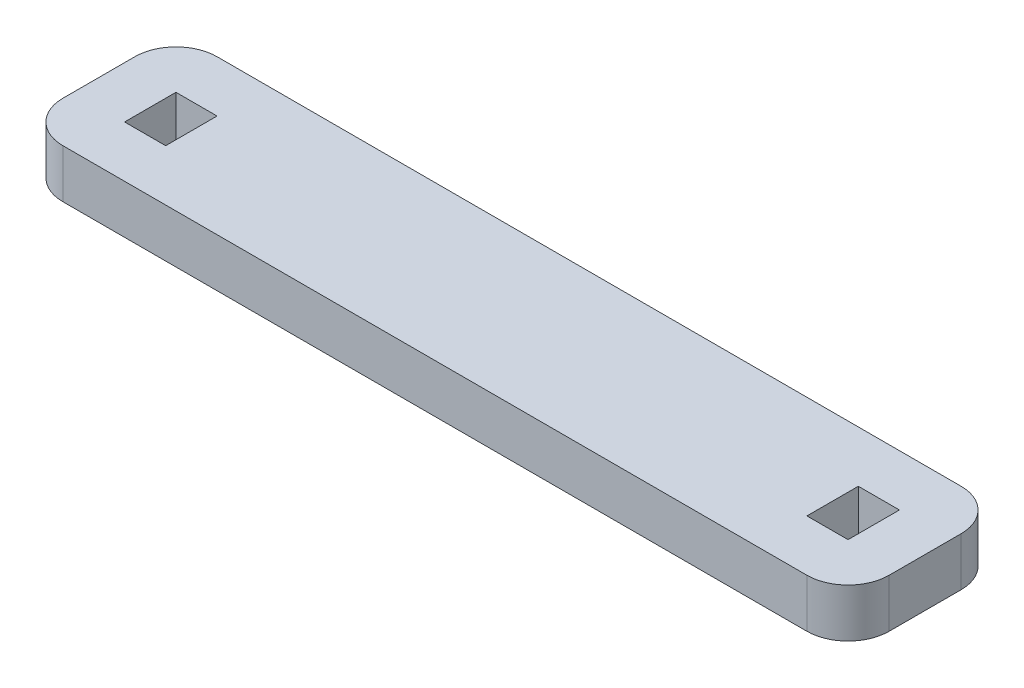
ISO-10303-21;
HEADER;
FILE_DESCRIPTION(('STEP AP214'),'2;1');
FILE_NAME('part.step','',(''),(''),'','','');
FILE_SCHEMA(('AUTOMOTIVE_DESIGN { 1 0 10303 214 1 1 1 1 }'));
ENDSEC;
DATA;
#1=APPLICATION_CONTEXT('core data for automotive mechanical design processes');
#2=APPLICATION_PROTOCOL_DEFINITION('international standard','automotive_design',2000,#1);
#3=PRODUCT_CONTEXT('',#1,'mechanical');
#4=PRODUCT('Part','Part','',(#3));
#5=PRODUCT_RELATED_PRODUCT_CATEGORY('part','',(#4));
#6=PRODUCT_DEFINITION_FORMATION('','',#4);
#7=PRODUCT_DEFINITION_CONTEXT('part definition',#1,'design');
#8=PRODUCT_DEFINITION('design','',#6,#7);
#9=PRODUCT_DEFINITION_SHAPE('','',#8);
#10=(LENGTH_UNIT() NAMED_UNIT(*) SI_UNIT(.MILLI.,.METRE.));
#11=(NAMED_UNIT(*) PLANE_ANGLE_UNIT() SI_UNIT($,.RADIAN.));
#12=(NAMED_UNIT(*) SI_UNIT($,.STERADIAN.) SOLID_ANGLE_UNIT());
#13=UNCERTAINTY_MEASURE_WITH_UNIT(LENGTH_MEASURE(1.E-05),#10,'distance_accuracy_value','');
#14=(GEOMETRIC_REPRESENTATION_CONTEXT(3) GLOBAL_UNCERTAINTY_ASSIGNED_CONTEXT((#13)) GLOBAL_UNIT_ASSIGNED_CONTEXT((#10,
#11,#12)) REPRESENTATION_CONTEXT('',''));
#15=CARTESIAN_POINT('',(0.,0.,0.));
#16=DIRECTION('',(0.,0.,1.));
#17=DIRECTION('',(1.,0.,0.));
#18=AXIS2_PLACEMENT_3D('',#15,#16,#17);
#19=CARTESIAN_POINT('',(0.,1.5,0.));
#20=DIRECTION('',(0.,1.,0.));
#21=DIRECTION('',(0.,0.,1.));
#22=AXIS2_PLACEMENT_3D('',#19,#20,#21);
#23=PLANE('',#22);
#24=DIRECTION('',(-1.,0.,0.));
#25=VECTOR('',#24,1.);
#26=CARTESIAN_POINT('',(25.527,1.5,-4.7625));
#27=LINE('',#26,#25);
#28=CARTESIAN_POINT('',(22.987,1.5,-4.7625));
#29=VERTEX_POINT('',#28);
#30=CARTESIAN_POINT('',(-22.987,1.5,-4.7625));
#31=VERTEX_POINT('',#30);
#32=EDGE_CURVE('E274',#29,#31,#27,.T.);
#33=ORIENTED_EDGE('',*,*,#32,.T.);
#34=CARTESIAN_POINT('',(-22.987,1.5,-2.2225));
#35=DIRECTION('',(0.,1.,0.));
#36=DIRECTION('',(0.,0.,1.));
#37=AXIS2_PLACEMENT_3D('',#34,#35,#36);
#38=CIRCLE('',#37,2.54);
#39=CARTESIAN_POINT('',(-25.527,1.5,-2.2225));
#40=VERTEX_POINT('',#39);
#41=EDGE_CURVE('E310',#31,#40,#38,.T.);
#42=ORIENTED_EDGE('',*,*,#41,.T.);
#43=DIRECTION('',(0.,0.,1.));
#44=VECTOR('',#43,1.);
#45=CARTESIAN_POINT('',(-25.527,1.5,4.7625));
#46=LINE('',#45,#44);
#47=CARTESIAN_POINT('',(-25.527,1.5,2.2225));
#48=VERTEX_POINT('',#47);
#49=EDGE_CURVE('E244',#40,#48,#46,.T.);
#50=ORIENTED_EDGE('',*,*,#49,.T.);
#51=CARTESIAN_POINT('',(-22.987,1.5,2.2225));
#52=DIRECTION('',(0.,1.,0.));
#53=DIRECTION('',(0.,0.,1.));
#54=AXIS2_PLACEMENT_3D('',#51,#52,#53);
#55=CIRCLE('',#54,2.54);
#56=CARTESIAN_POINT('',(-22.987,1.5,4.7625));
#57=VERTEX_POINT('',#56);
#58=EDGE_CURVE('E260',#48,#57,#55,.T.);
#59=ORIENTED_EDGE('',*,*,#58,.T.);
#60=DIRECTION('',(1.,0.,0.));
#61=VECTOR('',#60,1.);
#62=CARTESIAN_POINT('',(25.527,1.5,4.7625));
#63=LINE('',#62,#61);
#64=CARTESIAN_POINT('',(22.987,1.5,4.7625));
#65=VERTEX_POINT('',#64);
#66=EDGE_CURVE('E248',#57,#65,#63,.T.);
#67=ORIENTED_EDGE('',*,*,#66,.T.);
#68=CARTESIAN_POINT('',(22.987,1.5,2.2225));
#69=DIRECTION('',(0.,1.,0.));
#70=DIRECTION('',(0.,0.,1.));
#71=AXIS2_PLACEMENT_3D('',#68,#69,#70);
#72=CIRCLE('',#71,2.54);
#73=CARTESIAN_POINT('',(25.527,1.5,2.2225));
#74=VERTEX_POINT('',#73);
#75=EDGE_CURVE('E66',#65,#74,#72,.T.);
#76=ORIENTED_EDGE('',*,*,#75,.T.);
#77=DIRECTION('',(0.,0.,-1.));
#78=VECTOR('',#77,1.);
#79=CARTESIAN_POINT('',(25.527,1.5,4.7625));
#80=LINE('',#79,#78);
#81=CARTESIAN_POINT('',(25.527,1.5,-2.2225));
#82=VERTEX_POINT('',#81);
#83=EDGE_CURVE('E271',#74,#82,#80,.T.);
#84=ORIENTED_EDGE('',*,*,#83,.T.);
#85=CARTESIAN_POINT('',(22.987,1.5,-2.2225));
#86=DIRECTION('',(0.,1.,0.));
#87=DIRECTION('',(0.,0.,1.));
#88=AXIS2_PLACEMENT_3D('',#85,#86,#87);
#89=CIRCLE('',#88,2.54);
#90=EDGE_CURVE('E268',#82,#29,#89,.T.);
#91=ORIENTED_EDGE('',*,*,#90,.T.);
#92=EDGE_LOOP('',(#33,#42,#50,#59,#67,#76,#84,#91));
#93=FACE_BOUND('',#92,.T.);
#94=DIRECTION('',(1.,0.,0.));
#95=VECTOR('',#94,1.);
#96=CARTESIAN_POINT('',(-19.812,1.5,1.5875));
#97=LINE('',#96,#95);
#98=CARTESIAN_POINT('',(-22.352,1.5,1.5875));
#99=VERTEX_POINT('',#98);
#100=CARTESIAN_POINT('',(-19.812,1.5,1.5875));
#101=VERTEX_POINT('',#100);
#102=EDGE_CURVE('E211',#99,#101,#97,.T.);
#103=ORIENTED_EDGE('',*,*,#102,.F.);
#104=DIRECTION('',(0.,0.,1.));
#105=VECTOR('',#104,1.);
#106=CARTESIAN_POINT('',(-22.352,1.5,1.5875));
#107=LINE('',#106,#105);
#108=CARTESIAN_POINT('',(-22.352,1.5,-1.5875));
#109=VERTEX_POINT('',#108);
#110=EDGE_CURVE('E208',#109,#99,#107,.T.);
#111=ORIENTED_EDGE('',*,*,#110,.F.);
#112=DIRECTION('',(-1.,0.,0.));
#113=VECTOR('',#112,1.);
#114=CARTESIAN_POINT('',(-19.812,1.5,-1.5875));
#115=LINE('',#114,#113);
#116=CARTESIAN_POINT('',(-19.812,1.5,-1.5875));
#117=VERTEX_POINT('',#116);
#118=EDGE_CURVE('E218',#117,#109,#115,.T.);
#119=ORIENTED_EDGE('',*,*,#118,.F.);
#120=DIRECTION('',(0.,0.,-1.));
#121=VECTOR('',#120,1.);
#122=CARTESIAN_POINT('',(-19.812,1.5,1.5875));
#123=LINE('',#122,#121);
#124=EDGE_CURVE('E222',#101,#117,#123,.T.);
#125=ORIENTED_EDGE('',*,*,#124,.F.);
#126=EDGE_LOOP('',(#103,#111,#119,#125));
#127=FACE_BOUND('',#126,.T.);
#128=DIRECTION('',(1.,0.,0.));
#129=VECTOR('',#128,1.);
#130=CARTESIAN_POINT('',(22.352,1.5,1.5875));
#131=LINE('',#130,#129);
#132=CARTESIAN_POINT('',(19.812,1.5,1.5875));
#133=VERTEX_POINT('',#132);
#134=CARTESIAN_POINT('',(22.352,1.5,1.5875));
#135=VERTEX_POINT('',#134);
#136=EDGE_CURVE('E169',#133,#135,#131,.T.);
#137=ORIENTED_EDGE('',*,*,#136,.F.);
#138=DIRECTION('',(0.,0.,1.));
#139=VECTOR('',#138,1.);
#140=CARTESIAN_POINT('',(19.812,1.5,1.5875));
#141=LINE('',#140,#139);
#142=CARTESIAN_POINT('',(19.812,1.5,-1.5875));
#143=VERTEX_POINT('',#142);
#144=EDGE_CURVE('E159',#143,#133,#141,.T.);
#145=ORIENTED_EDGE('',*,*,#144,.F.);
#146=DIRECTION('',(-1.,0.,0.));
#147=VECTOR('',#146,1.);
#148=CARTESIAN_POINT('',(22.352,1.5,-1.5875));
#149=LINE('',#148,#147);
#150=CARTESIAN_POINT('',(22.352,1.5,-1.5875));
#151=VERTEX_POINT('',#150);
#152=EDGE_CURVE('E184',#151,#143,#149,.T.);
#153=ORIENTED_EDGE('',*,*,#152,.F.);
#154=DIRECTION('',(0.,0.,-1.));
#155=VECTOR('',#154,1.);
#156=CARTESIAN_POINT('',(22.352,1.5,1.5875));
#157=LINE('',#156,#155);
#158=EDGE_CURVE('E182',#135,#151,#157,.T.);
#159=ORIENTED_EDGE('',*,*,#158,.F.);
#160=EDGE_LOOP('',(#137,#145,#153,#159));
#161=FACE_BOUND('',#160,.T.);
#162=ADVANCED_FACE('F44',(#93,#127,#161),#23,.T.);
#163=CARTESIAN_POINT('',(0.,-1.5,0.));
#164=DIRECTION('',(0.,1.,0.));
#165=DIRECTION('',(0.,0.,1.));
#166=AXIS2_PLACEMENT_3D('',#163,#164,#165);
#167=PLANE('',#166);
#168=DIRECTION('',(0.,0.,1.));
#169=VECTOR('',#168,1.);
#170=CARTESIAN_POINT('',(-22.352,-1.5,1.5875));
#171=LINE('',#170,#169);
#172=CARTESIAN_POINT('',(-22.352,-1.5,-1.5875));
#173=VERTEX_POINT('',#172);
#174=CARTESIAN_POINT('',(-22.352,-1.5,1.5875));
#175=VERTEX_POINT('',#174);
#176=EDGE_CURVE('E177',#173,#175,#171,.T.);
#177=ORIENTED_EDGE('',*,*,#176,.T.);
#178=DIRECTION('',(1.,0.,0.));
#179=VECTOR('',#178,1.);
#180=CARTESIAN_POINT('',(-19.812,-1.5,1.5875));
#181=LINE('',#180,#179);
#182=CARTESIAN_POINT('',(-19.812,-1.5,1.5875));
#183=VERTEX_POINT('',#182);
#184=EDGE_CURVE('E226',#175,#183,#181,.T.);
#185=ORIENTED_EDGE('',*,*,#184,.T.);
#186=DIRECTION('',(0.,0.,-1.));
#187=VECTOR('',#186,1.);
#188=CARTESIAN_POINT('',(-19.812,-1.5,1.5875));
#189=LINE('',#188,#187);
#190=CARTESIAN_POINT('',(-19.812,-1.5,-1.5875));
#191=VERTEX_POINT('',#190);
#192=EDGE_CURVE('E229',#183,#191,#189,.T.);
#193=ORIENTED_EDGE('',*,*,#192,.T.);
#194=DIRECTION('',(-1.,0.,0.));
#195=VECTOR('',#194,1.);
#196=CARTESIAN_POINT('',(-19.812,-1.5,-1.5875));
#197=LINE('',#196,#195);
#198=EDGE_CURVE('E212',#191,#173,#197,.T.);
#199=ORIENTED_EDGE('',*,*,#198,.T.);
#200=EDGE_LOOP('',(#177,#185,#193,#199));
#201=FACE_BOUND('',#200,.T.);
#202=DIRECTION('',(0.,0.,1.));
#203=VECTOR('',#202,1.);
#204=CARTESIAN_POINT('',(-25.527,-1.5,4.7625));
#205=LINE('',#204,#203);
#206=CARTESIAN_POINT('',(-25.527,-1.5,-2.2225));
#207=VERTEX_POINT('',#206);
#208=CARTESIAN_POINT('',(-25.527,-1.5,2.2225));
#209=VERTEX_POINT('',#208);
#210=EDGE_CURVE('E243',#207,#209,#205,.T.);
#211=ORIENTED_EDGE('',*,*,#210,.F.);
#212=CARTESIAN_POINT('',(-22.987,-1.5,-2.2225));
#213=DIRECTION('',(0.,1.,0.));
#214=DIRECTION('',(0.,0.,1.));
#215=AXIS2_PLACEMENT_3D('',#212,#213,#214);
#216=CIRCLE('',#215,2.54);
#217=CARTESIAN_POINT('',(-22.987,-1.5,-4.7625));
#218=VERTEX_POINT('',#217);
#219=EDGE_CURVE('E298',#207,#218,#216,.F.);
#220=ORIENTED_EDGE('',*,*,#219,.T.);
#221=DIRECTION('',(-1.,0.,0.));
#222=VECTOR('',#221,1.);
#223=CARTESIAN_POINT('',(25.527,-1.5,-4.7625));
#224=LINE('',#223,#222);
#225=CARTESIAN_POINT('',(22.987,-1.5,-4.7625));
#226=VERTEX_POINT('',#225);
#227=EDGE_CURVE('E249',#226,#218,#224,.T.);
#228=ORIENTED_EDGE('',*,*,#227,.F.);
#229=CARTESIAN_POINT('',(22.987,-1.5,-2.2225));
#230=DIRECTION('',(0.,1.,0.));
#231=DIRECTION('',(0.,0.,1.));
#232=AXIS2_PLACEMENT_3D('',#229,#230,#231);
#233=CIRCLE('',#232,2.54);
#234=CARTESIAN_POINT('',(25.527,-1.5,-2.2225));
#235=VERTEX_POINT('',#234);
#236=EDGE_CURVE('E296',#226,#235,#233,.F.);
#237=ORIENTED_EDGE('',*,*,#236,.T.);
#238=DIRECTION('',(0.,0.,-1.));
#239=VECTOR('',#238,1.);
#240=CARTESIAN_POINT('',(25.527,-1.5,4.7625));
#241=LINE('',#240,#239);
#242=CARTESIAN_POINT('',(25.527,-1.5,2.2225));
#243=VERTEX_POINT('',#242);
#244=EDGE_CURVE('E284',#243,#235,#241,.T.);
#245=ORIENTED_EDGE('',*,*,#244,.F.);
#246=CARTESIAN_POINT('',(22.987,-1.5,2.2225));
#247=DIRECTION('',(0.,1.,0.));
#248=DIRECTION('',(0.,0.,1.));
#249=AXIS2_PLACEMENT_3D('',#246,#247,#248);
#250=CIRCLE('',#249,2.54);
#251=CARTESIAN_POINT('',(22.987,-1.5,4.7625));
#252=VERTEX_POINT('',#251);
#253=EDGE_CURVE('E294',#243,#252,#250,.F.);
#254=ORIENTED_EDGE('',*,*,#253,.T.);
#255=DIRECTION('',(1.,0.,0.));
#256=VECTOR('',#255,1.);
#257=CARTESIAN_POINT('',(25.527,-1.5,4.7625));
#258=LINE('',#257,#256);
#259=CARTESIAN_POINT('',(-22.987,-1.5,4.7625));
#260=VERTEX_POINT('',#259);
#261=EDGE_CURVE('E281',#260,#252,#258,.T.);
#262=ORIENTED_EDGE('',*,*,#261,.F.);
#263=CARTESIAN_POINT('',(-22.987,-1.5,2.2225));
#264=DIRECTION('',(0.,1.,0.));
#265=DIRECTION('',(0.,0.,1.));
#266=AXIS2_PLACEMENT_3D('',#263,#264,#265);
#267=CIRCLE('',#266,2.54);
#268=EDGE_CURVE('E292',#260,#209,#267,.F.);
#269=ORIENTED_EDGE('',*,*,#268,.T.);
#270=EDGE_LOOP('',(#211,#220,#228,#237,#245,#254,#262,#269));
#271=FACE_BOUND('',#270,.T.);
#272=DIRECTION('',(0.,0.,1.));
#273=VECTOR('',#272,1.);
#274=CARTESIAN_POINT('',(19.812,-1.5,1.5875));
#275=LINE('',#274,#273);
#276=CARTESIAN_POINT('',(19.812,-1.5,-1.5875));
#277=VERTEX_POINT('',#276);
#278=CARTESIAN_POINT('',(19.812,-1.5,1.5875));
#279=VERTEX_POINT('',#278);
#280=EDGE_CURVE('E196',#277,#279,#275,.T.);
#281=ORIENTED_EDGE('',*,*,#280,.T.);
#282=DIRECTION('',(1.,0.,0.));
#283=VECTOR('',#282,1.);
#284=CARTESIAN_POINT('',(22.352,-1.5,1.5875));
#285=LINE('',#284,#283);
#286=CARTESIAN_POINT('',(22.352,-1.5,1.5875));
#287=VERTEX_POINT('',#286);
#288=EDGE_CURVE('E176',#279,#287,#285,.T.);
#289=ORIENTED_EDGE('',*,*,#288,.T.);
#290=DIRECTION('',(0.,0.,-1.));
#291=VECTOR('',#290,1.);
#292=CARTESIAN_POINT('',(22.352,-1.5,1.5875));
#293=LINE('',#292,#291);
#294=CARTESIAN_POINT('',(22.352,-1.5,-1.5875));
#295=VERTEX_POINT('',#294);
#296=EDGE_CURVE('E199',#287,#295,#293,.T.);
#297=ORIENTED_EDGE('',*,*,#296,.T.);
#298=DIRECTION('',(-1.,0.,0.));
#299=VECTOR('',#298,1.);
#300=CARTESIAN_POINT('',(22.352,-1.5,-1.5875));
#301=LINE('',#300,#299);
#302=EDGE_CURVE('E170',#295,#277,#301,.T.);
#303=ORIENTED_EDGE('',*,*,#302,.T.);
#304=EDGE_LOOP('',(#281,#289,#297,#303));
#305=FACE_BOUND('',#304,.T.);
#306=ADVANCED_FACE('F331',(#201,#271,#305),#167,.F.);
#307=CARTESIAN_POINT('',(-25.527,1.5,4.7625));
#308=DIRECTION('',(1.,0.,0.));
#309=DIRECTION('',(0.,0.,-1.));
#310=AXIS2_PLACEMENT_3D('',#307,#308,#309);
#311=PLANE('',#310);
#312=ORIENTED_EDGE('',*,*,#49,.F.);
#313=DIRECTION('',(0.,-1.,0.));
#314=VECTOR('',#313,1.);
#315=CARTESIAN_POINT('',(-25.527,1.5,-2.2225));
#316=LINE('',#315,#314);
#317=EDGE_CURVE('E289',#40,#207,#316,.T.);
#318=ORIENTED_EDGE('',*,*,#317,.T.);
#319=ORIENTED_EDGE('',*,*,#210,.T.);
#320=DIRECTION('',(0.,-1.,0.));
#321=VECTOR('',#320,1.);
#322=CARTESIAN_POINT('',(-25.527,1.5,2.2225));
#323=LINE('',#322,#321);
#324=EDGE_CURVE('E278',#209,#48,#323,.F.);
#325=ORIENTED_EDGE('',*,*,#324,.T.);
#326=EDGE_LOOP('',(#312,#318,#319,#325));
#327=FACE_BOUND('',#326,.T.);
#328=ADVANCED_FACE('F341',(#327),#311,.F.);
#329=CARTESIAN_POINT('',(25.527,1.5,4.7625));
#330=DIRECTION('',(0.,0.,-1.));
#331=DIRECTION('',(-1.,0.,0.));
#332=AXIS2_PLACEMENT_3D('',#329,#330,#331);
#333=PLANE('',#332);
#334=ORIENTED_EDGE('',*,*,#261,.T.);
#335=DIRECTION('',(0.,-1.,0.));
#336=VECTOR('',#335,1.);
#337=CARTESIAN_POINT('',(22.987,1.5,4.7625));
#338=LINE('',#337,#336);
#339=EDGE_CURVE('E12',#252,#65,#338,.F.);
#340=ORIENTED_EDGE('',*,*,#339,.T.);
#341=ORIENTED_EDGE('',*,*,#66,.F.);
#342=DIRECTION('',(0.,-1.,0.));
#343=VECTOR('',#342,1.);
#344=CARTESIAN_POINT('',(-22.987,1.5,4.7625));
#345=LINE('',#344,#343);
#346=EDGE_CURVE('E52',#57,#260,#345,.T.);
#347=ORIENTED_EDGE('',*,*,#346,.T.);
#348=EDGE_LOOP('',(#334,#340,#341,#347));
#349=FACE_BOUND('',#348,.T.);
#350=ADVANCED_FACE('F325',(#349),#333,.F.);
#351=CARTESIAN_POINT('',(25.527,1.5,4.7625));
#352=DIRECTION('',(-1.,0.,0.));
#353=DIRECTION('',(0.,0.,1.));
#354=AXIS2_PLACEMENT_3D('',#351,#352,#353);
#355=PLANE('',#354);
#356=ORIENTED_EDGE('',*,*,#244,.T.);
#357=DIRECTION('',(0.,-1.,0.));
#358=VECTOR('',#357,1.);
#359=CARTESIAN_POINT('',(25.527,1.5,-2.2225));
#360=LINE('',#359,#358);
#361=EDGE_CURVE('E59',#235,#82,#360,.F.);
#362=ORIENTED_EDGE('',*,*,#361,.T.);
#363=ORIENTED_EDGE('',*,*,#83,.F.);
#364=DIRECTION('',(0.,-1.,0.));
#365=VECTOR('',#364,1.);
#366=CARTESIAN_POINT('',(25.527,1.5,2.2225));
#367=LINE('',#366,#365);
#368=EDGE_CURVE('E315',#74,#243,#367,.T.);
#369=ORIENTED_EDGE('',*,*,#368,.T.);
#370=EDGE_LOOP('',(#356,#362,#363,#369));
#371=FACE_BOUND('',#370,.T.);
#372=ADVANCED_FACE('F337',(#371),#355,.F.);
#373=CARTESIAN_POINT('',(25.527,1.5,-4.7625));
#374=DIRECTION('',(0.,0.,1.));
#375=DIRECTION('',(1.,0.,0.));
#376=AXIS2_PLACEMENT_3D('',#373,#374,#375);
#377=PLANE('',#376);
#378=ORIENTED_EDGE('',*,*,#227,.T.);
#379=DIRECTION('',(0.,-1.,0.));
#380=VECTOR('',#379,1.);
#381=CARTESIAN_POINT('',(-22.987,1.5,-4.7625));
#382=LINE('',#381,#380);
#383=EDGE_CURVE('E264',#218,#31,#382,.F.);
#384=ORIENTED_EDGE('',*,*,#383,.T.);
#385=ORIENTED_EDGE('',*,*,#32,.F.);
#386=DIRECTION('',(0.,-1.,0.));
#387=VECTOR('',#386,1.);
#388=CARTESIAN_POINT('',(22.987,1.5,-4.7625));
#389=LINE('',#388,#387);
#390=EDGE_CURVE('E299',#29,#226,#389,.T.);
#391=ORIENTED_EDGE('',*,*,#390,.T.);
#392=EDGE_LOOP('',(#378,#384,#385,#391));
#393=FACE_BOUND('',#392,.T.);
#394=ADVANCED_FACE('F306',(#393),#377,.F.);
#395=CARTESIAN_POINT('',(-22.352,1.5,1.5875));
#396=DIRECTION('',(1.,0.,0.));
#397=DIRECTION('',(0.,0.,-1.));
#398=AXIS2_PLACEMENT_3D('',#395,#396,#397);
#399=PLANE('',#398);
#400=ORIENTED_EDGE('',*,*,#176,.F.);
#401=DIRECTION('',(0.,-1.,0.));
#402=VECTOR('',#401,1.);
#403=CARTESIAN_POINT('',(-22.352,1.5,-1.5875));
#404=LINE('',#403,#402);
#405=EDGE_CURVE('E221',#109,#173,#404,.T.);
#406=ORIENTED_EDGE('',*,*,#405,.F.);
#407=ORIENTED_EDGE('',*,*,#110,.T.);
#408=DIRECTION('',(0.,-1.,0.));
#409=VECTOR('',#408,1.);
#410=CARTESIAN_POINT('',(-22.352,1.5,1.5875));
#411=LINE('',#410,#409);
#412=EDGE_CURVE('E240',#99,#175,#411,.T.);
#413=ORIENTED_EDGE('',*,*,#412,.T.);
#414=EDGE_LOOP('',(#400,#406,#407,#413));
#415=FACE_BOUND('',#414,.T.);
#416=ADVANCED_FACE('F356',(#415),#399,.T.);
#417=CARTESIAN_POINT('',(-19.812,1.5,1.5875));
#418=DIRECTION('',(0.,0.,-1.));
#419=DIRECTION('',(-1.,0.,0.));
#420=AXIS2_PLACEMENT_3D('',#417,#418,#419);
#421=PLANE('',#420);
#422=ORIENTED_EDGE('',*,*,#184,.F.);
#423=ORIENTED_EDGE('',*,*,#412,.F.);
#424=ORIENTED_EDGE('',*,*,#102,.T.);
#425=DIRECTION('',(0.,-1.,0.));
#426=VECTOR('',#425,1.);
#427=CARTESIAN_POINT('',(-19.812,1.5,1.5875));
#428=LINE('',#427,#426);
#429=EDGE_CURVE('E238',#101,#183,#428,.T.);
#430=ORIENTED_EDGE('',*,*,#429,.T.);
#431=EDGE_LOOP('',(#422,#423,#424,#430));
#432=FACE_BOUND('',#431,.T.);
#433=ADVANCED_FACE('F438',(#432),#421,.T.);
#434=CARTESIAN_POINT('',(-19.812,1.5,1.5875));
#435=DIRECTION('',(-1.,0.,0.));
#436=DIRECTION('',(0.,0.,1.));
#437=AXIS2_PLACEMENT_3D('',#434,#435,#436);
#438=PLANE('',#437);
#439=ORIENTED_EDGE('',*,*,#192,.F.);
#440=ORIENTED_EDGE('',*,*,#429,.F.);
#441=ORIENTED_EDGE('',*,*,#124,.T.);
#442=DIRECTION('',(0.,-1.,0.));
#443=VECTOR('',#442,1.);
#444=CARTESIAN_POINT('',(-19.812,1.5,-1.5875));
#445=LINE('',#444,#443);
#446=EDGE_CURVE('E236',#117,#191,#445,.T.);
#447=ORIENTED_EDGE('',*,*,#446,.T.);
#448=EDGE_LOOP('',(#439,#440,#441,#447));
#449=FACE_BOUND('',#448,.T.);
#450=ADVANCED_FACE('F429',(#449),#438,.T.);
#451=CARTESIAN_POINT('',(-19.812,1.5,-1.5875));
#452=DIRECTION('',(0.,0.,1.));
#453=DIRECTION('',(1.,0.,0.));
#454=AXIS2_PLACEMENT_3D('',#451,#452,#453);
#455=PLANE('',#454);
#456=ORIENTED_EDGE('',*,*,#198,.F.);
#457=ORIENTED_EDGE('',*,*,#446,.F.);
#458=ORIENTED_EDGE('',*,*,#118,.T.);
#459=ORIENTED_EDGE('',*,*,#405,.T.);
#460=EDGE_LOOP('',(#456,#457,#458,#459));
#461=FACE_BOUND('',#460,.T.);
#462=ADVANCED_FACE('F421',(#461),#455,.T.);
#463=CARTESIAN_POINT('',(19.812,1.5,1.5875));
#464=DIRECTION('',(1.,0.,0.));
#465=DIRECTION('',(0.,0.,-1.));
#466=AXIS2_PLACEMENT_3D('',#463,#464,#465);
#467=PLANE('',#466);
#468=ORIENTED_EDGE('',*,*,#280,.F.);
#469=DIRECTION('',(0.,-1.,0.));
#470=VECTOR('',#469,1.);
#471=CARTESIAN_POINT('',(19.812,1.5,-1.5875));
#472=LINE('',#471,#470);
#473=EDGE_CURVE('E165',#143,#277,#472,.T.);
#474=ORIENTED_EDGE('',*,*,#473,.F.);
#475=ORIENTED_EDGE('',*,*,#144,.T.);
#476=DIRECTION('',(0.,-1.,0.));
#477=VECTOR('',#476,1.);
#478=CARTESIAN_POINT('',(19.812,1.5,1.5875));
#479=LINE('',#478,#477);
#480=EDGE_CURVE('E162',#133,#279,#479,.T.);
#481=ORIENTED_EDGE('',*,*,#480,.T.);
#482=EDGE_LOOP('',(#468,#474,#475,#481));
#483=FACE_BOUND('',#482,.T.);
#484=ADVANCED_FACE('F161',(#483),#467,.T.);
#485=CARTESIAN_POINT('',(22.352,1.5,1.5875));
#486=DIRECTION('',(0.,0.,-1.));
#487=DIRECTION('',(-1.,0.,0.));
#488=AXIS2_PLACEMENT_3D('',#485,#486,#487);
#489=PLANE('',#488);
#490=ORIENTED_EDGE('',*,*,#288,.F.);
#491=ORIENTED_EDGE('',*,*,#480,.F.);
#492=ORIENTED_EDGE('',*,*,#136,.T.);
#493=DIRECTION('',(0.,-1.,0.));
#494=VECTOR('',#493,1.);
#495=CARTESIAN_POINT('',(22.352,1.5,1.5875));
#496=LINE('',#495,#494);
#497=EDGE_CURVE('E178',#135,#287,#496,.T.);
#498=ORIENTED_EDGE('',*,*,#497,.T.);
#499=EDGE_LOOP('',(#490,#491,#492,#498));
#500=FACE_BOUND('',#499,.T.);
#501=ADVANCED_FACE('F173',(#500),#489,.T.);
#502=CARTESIAN_POINT('',(22.352,1.5,1.5875));
#503=DIRECTION('',(-1.,0.,0.));
#504=DIRECTION('',(0.,0.,1.));
#505=AXIS2_PLACEMENT_3D('',#502,#503,#504);
#506=PLANE('',#505);
#507=ORIENTED_EDGE('',*,*,#296,.F.);
#508=ORIENTED_EDGE('',*,*,#497,.F.);
#509=ORIENTED_EDGE('',*,*,#158,.T.);
#510=DIRECTION('',(0.,-1.,0.));
#511=VECTOR('',#510,1.);
#512=CARTESIAN_POINT('',(22.352,1.5,-1.5875));
#513=LINE('',#512,#511);
#514=EDGE_CURVE('E205',#151,#295,#513,.T.);
#515=ORIENTED_EDGE('',*,*,#514,.T.);
#516=EDGE_LOOP('',(#507,#508,#509,#515));
#517=FACE_BOUND('',#516,.T.);
#518=ADVANCED_FACE('F397',(#517),#506,.T.);
#519=CARTESIAN_POINT('',(22.352,1.5,-1.5875));
#520=DIRECTION('',(0.,0.,1.));
#521=DIRECTION('',(1.,0.,0.));
#522=AXIS2_PLACEMENT_3D('',#519,#520,#521);
#523=PLANE('',#522);
#524=ORIENTED_EDGE('',*,*,#302,.F.);
#525=ORIENTED_EDGE('',*,*,#514,.F.);
#526=ORIENTED_EDGE('',*,*,#152,.T.);
#527=ORIENTED_EDGE('',*,*,#473,.T.);
#528=EDGE_LOOP('',(#524,#525,#526,#527));
#529=FACE_BOUND('',#528,.T.);
#530=ADVANCED_FACE('F369',(#529),#523,.T.);
#531=CARTESIAN_POINT('',(-22.987,1.5,-2.2225));
#532=DIRECTION('',(0.,-1.,0.));
#533=DIRECTION('',(0.,0.,-1.));
#534=AXIS2_PLACEMENT_3D('',#531,#532,#533);
#535=CYLINDRICAL_SURFACE('',#534,2.54);
#536=ORIENTED_EDGE('',*,*,#41,.F.);
#537=ORIENTED_EDGE('',*,*,#383,.F.);
#538=ORIENTED_EDGE('',*,*,#219,.F.);
#539=ORIENTED_EDGE('',*,*,#317,.F.);
#540=EDGE_LOOP('',(#536,#537,#538,#539));
#541=FACE_BOUND('',#540,.T.);
#542=ADVANCED_FACE('F314',(#541),#535,.T.);
#543=CARTESIAN_POINT('',(22.987,1.5,-2.2225));
#544=DIRECTION('',(0.,-1.,0.));
#545=DIRECTION('',(0.,0.,-1.));
#546=AXIS2_PLACEMENT_3D('',#543,#544,#545);
#547=CYLINDRICAL_SURFACE('',#546,2.54);
#548=ORIENTED_EDGE('',*,*,#90,.F.);
#549=ORIENTED_EDGE('',*,*,#361,.F.);
#550=ORIENTED_EDGE('',*,*,#236,.F.);
#551=ORIENTED_EDGE('',*,*,#390,.F.);
#552=EDGE_LOOP('',(#548,#549,#550,#551));
#553=FACE_BOUND('',#552,.T.);
#554=ADVANCED_FACE('F339',(#553),#547,.T.);
#555=CARTESIAN_POINT('',(22.987,1.5,2.2225));
#556=DIRECTION('',(0.,-1.,0.));
#557=DIRECTION('',(0.,0.,-1.));
#558=AXIS2_PLACEMENT_3D('',#555,#556,#557);
#559=CYLINDRICAL_SURFACE('',#558,2.54);
#560=ORIENTED_EDGE('',*,*,#75,.F.);
#561=ORIENTED_EDGE('',*,*,#339,.F.);
#562=ORIENTED_EDGE('',*,*,#253,.F.);
#563=ORIENTED_EDGE('',*,*,#368,.F.);
#564=EDGE_LOOP('',(#560,#561,#562,#563));
#565=FACE_BOUND('',#564,.T.);
#566=ADVANCED_FACE('F336',(#565),#559,.T.);
#567=CARTESIAN_POINT('',(-22.987,1.5,2.2225));
#568=DIRECTION('',(0.,-1.,0.));
#569=DIRECTION('',(0.,0.,-1.));
#570=AXIS2_PLACEMENT_3D('',#567,#568,#569);
#571=CYLINDRICAL_SURFACE('',#570,2.54);
#572=ORIENTED_EDGE('',*,*,#58,.F.);
#573=ORIENTED_EDGE('',*,*,#324,.F.);
#574=ORIENTED_EDGE('',*,*,#268,.F.);
#575=ORIENTED_EDGE('',*,*,#346,.F.);
#576=EDGE_LOOP('',(#572,#573,#574,#575));
#577=FACE_BOUND('',#576,.T.);
#578=ADVANCED_FACE('F46',(#577),#571,.T.);
#579=CLOSED_SHELL('',(#162,#306,#328,#350,#372,#394,#416,#433,#450,#462,#484,#501,#518,#530,
#542,#554,#566,#578));
#580=MANIFOLD_SOLID_BREP('B2',#579);
#581=ADVANCED_BREP_SHAPE_REPRESENTATION('',(#18,#580),#14);
#582=SHAPE_DEFINITION_REPRESENTATION(#9,#581);
ENDSEC;
END-ISO-10303-21;
